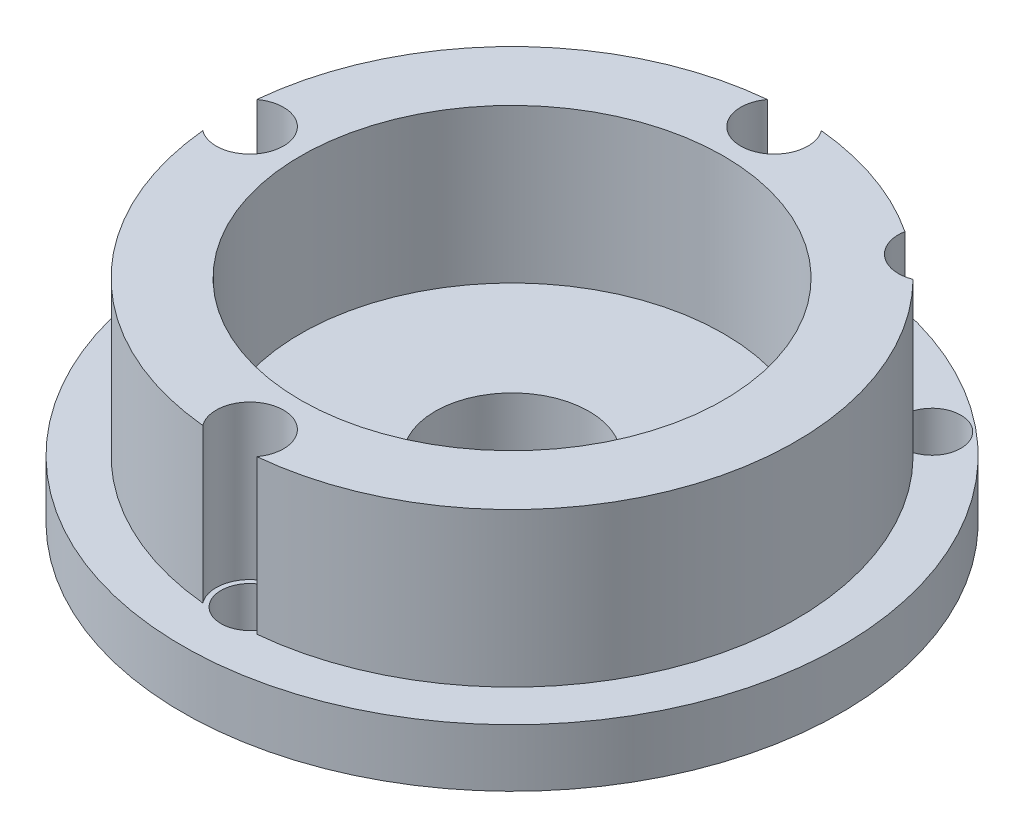
ISO-10303-21;
HEADER;
FILE_DESCRIPTION(('STEP AP214'),'2;1');
FILE_NAME('part.step','',(''),(''),'','','');
FILE_SCHEMA(('AUTOMOTIVE_DESIGN { 1 0 10303 214 1 1 1 1 }'));
ENDSEC;
DATA;
#1=APPLICATION_CONTEXT('core data for automotive mechanical design processes');
#2=APPLICATION_PROTOCOL_DEFINITION('international standard','automotive_design',2000,#1);
#3=PRODUCT_CONTEXT('',#1,'mechanical');
#4=PRODUCT('Part','Part','',(#3));
#5=PRODUCT_RELATED_PRODUCT_CATEGORY('part','',(#4));
#6=PRODUCT_DEFINITION_FORMATION('','',#4);
#7=PRODUCT_DEFINITION_CONTEXT('part definition',#1,'design');
#8=PRODUCT_DEFINITION('design','',#6,#7);
#9=PRODUCT_DEFINITION_SHAPE('','',#8);
#10=(LENGTH_UNIT() NAMED_UNIT(*) SI_UNIT(.MILLI.,.METRE.));
#11=(NAMED_UNIT(*) PLANE_ANGLE_UNIT() SI_UNIT($,.RADIAN.));
#12=(NAMED_UNIT(*) SI_UNIT($,.STERADIAN.) SOLID_ANGLE_UNIT());
#13=UNCERTAINTY_MEASURE_WITH_UNIT(LENGTH_MEASURE(1.E-05),#10,'distance_accuracy_value','');
#14=(GEOMETRIC_REPRESENTATION_CONTEXT(3) GLOBAL_UNCERTAINTY_ASSIGNED_CONTEXT((#13)) GLOBAL_UNIT_ASSIGNED_CONTEXT((#10,
#11,#12)) REPRESENTATION_CONTEXT('',''));
#15=CARTESIAN_POINT('',(0.,0.,0.));
#16=DIRECTION('',(0.,0.,1.));
#17=DIRECTION('',(1.,0.,0.));
#18=AXIS2_PLACEMENT_3D('',#15,#16,#17);
#19=CARTESIAN_POINT('',(-17.1428571428571,3.,0.));
#20=DIRECTION('',(0.,-1.,0.));
#21=DIRECTION('',(0.,0.,-1.));
#22=AXIS2_PLACEMENT_3D('',#19,#20,#21);
#23=PLANE('',#22);
#24=CARTESIAN_POINT('',(0.,3.,0.));
#25=DIRECTION('',(0.,1.,0.));
#26=DIRECTION('',(0.,0.,1.));
#27=AXIS2_PLACEMENT_3D('',#24,#25,#26);
#28=CIRCLE('',#27,4.);
#29=CARTESIAN_POINT('',(0.,3.,4.));
#30=VERTEX_POINT('',#29);
#31=EDGE_CURVE('E159',#30,#30,#28,.F.);
#32=ORIENTED_EDGE('',*,*,#31,.T.);
#33=EDGE_LOOP('',(#32));
#34=FACE_BOUND('',#33,.T.);
#35=CARTESIAN_POINT('',(0.,3.,0.));
#36=DIRECTION('',(0.,-1.,0.));
#37=DIRECTION('',(0.,0.,-1.));
#38=AXIS2_PLACEMENT_3D('',#35,#36,#37);
#39=CIRCLE('',#38,11.);
#40=CARTESIAN_POINT('',(0.,3.,-11.));
#41=VERTEX_POINT('',#40);
#42=EDGE_CURVE('E11',#41,#41,#39,.T.);
#43=ORIENTED_EDGE('',*,*,#42,.F.);
#44=EDGE_LOOP('',(#43));
#45=FACE_BOUND('',#44,.T.);
#46=ADVANCED_FACE('F39',(#34,#45),#23,.F.);
#47=CARTESIAN_POINT('',(-13.64,-7.,0.));
#48=DIRECTION('',(0.,1.,0.));
#49=DIRECTION('',(0.,0.,1.));
#50=AXIS2_PLACEMENT_3D('',#47,#48,#49);
#51=CYLINDRICAL_SURFACE('',#50,1.5);
#52=CARTESIAN_POINT('',(-13.64,0.,0.));
#53=DIRECTION('',(0.,1.,0.));
#54=DIRECTION('',(0.,0.,1.));
#55=AXIS2_PLACEMENT_3D('',#52,#53,#54);
#56=CIRCLE('',#55,1.5);
#57=CARTESIAN_POINT('',(-13.64,0.,1.5));
#58=VERTEX_POINT('',#57);
#59=EDGE_CURVE('E275',#58,#58,#56,.T.);
#60=ORIENTED_EDGE('',*,*,#59,.F.);
#61=EDGE_LOOP('',(#60));
#62=FACE_BOUND('',#61,.T.);
#63=CARTESIAN_POINT('',(-13.64,3.,0.));
#64=DIRECTION('',(0.,1.,0.));
#65=DIRECTION('',(0.,0.,1.));
#66=AXIS2_PLACEMENT_3D('',#63,#64,#65);
#67=CIRCLE('',#66,1.5);
#68=CARTESIAN_POINT('',(-13.64,3.,1.5));
#69=VERTEX_POINT('',#68);
#70=EDGE_CURVE('E245',#69,#69,#67,.T.);
#71=ORIENTED_EDGE('',*,*,#70,.T.);
#72=EDGE_LOOP('',(#71));
#73=FACE_BOUND('',#72,.T.);
#74=ADVANCED_FACE('F222',(#62,#73),#51,.F.);
#75=CARTESIAN_POINT('',(0.,-7.,13.64));
#76=DIRECTION('',(0.,1.,0.));
#77=DIRECTION('',(0.,0.,1.));
#78=AXIS2_PLACEMENT_3D('',#75,#76,#77);
#79=CYLINDRICAL_SURFACE('',#78,1.5);
#80=CARTESIAN_POINT('',(0.,0.,13.64));
#81=DIRECTION('',(0.,1.,0.));
#82=DIRECTION('',(0.,0.,1.));
#83=AXIS2_PLACEMENT_3D('',#80,#81,#82);
#84=CIRCLE('',#83,1.5);
#85=CARTESIAN_POINT('',(0.,0.,15.14));
#86=VERTEX_POINT('',#85);
#87=EDGE_CURVE('E279',#86,#86,#84,.T.);
#88=ORIENTED_EDGE('',*,*,#87,.F.);
#89=EDGE_LOOP('',(#88));
#90=FACE_BOUND('',#89,.T.);
#91=CARTESIAN_POINT('',(0.,3.,13.64));
#92=DIRECTION('',(0.,1.,0.));
#93=DIRECTION('',(0.,0.,1.));
#94=AXIS2_PLACEMENT_3D('',#91,#92,#93);
#95=CIRCLE('',#94,1.5);
#96=CARTESIAN_POINT('',(0.,3.,15.14));
#97=VERTEX_POINT('',#96);
#98=EDGE_CURVE('E256',#97,#97,#95,.T.);
#99=ORIENTED_EDGE('',*,*,#98,.T.);
#100=EDGE_LOOP('',(#99));
#101=FACE_BOUND('',#100,.T.);
#102=ADVANCED_FACE('F227',(#90,#101),#79,.F.);
#103=CARTESIAN_POINT('',(0.,-7.,-13.64));
#104=DIRECTION('',(0.,1.,0.));
#105=DIRECTION('',(0.,0.,1.));
#106=AXIS2_PLACEMENT_3D('',#103,#104,#105);
#107=CYLINDRICAL_SURFACE('',#106,1.5);
#108=CARTESIAN_POINT('',(0.,0.,-13.64));
#109=DIRECTION('',(0.,1.,0.));
#110=DIRECTION('',(0.,0.,1.));
#111=AXIS2_PLACEMENT_3D('',#108,#109,#110);
#112=CIRCLE('',#111,1.5);
#113=CARTESIAN_POINT('',(0.,0.,-12.14));
#114=VERTEX_POINT('',#113);
#115=EDGE_CURVE('E271',#114,#114,#112,.T.);
#116=ORIENTED_EDGE('',*,*,#115,.F.);
#117=EDGE_LOOP('',(#116));
#118=FACE_BOUND('',#117,.T.);
#119=CARTESIAN_POINT('',(0.,3.,-13.64));
#120=DIRECTION('',(0.,1.,0.));
#121=DIRECTION('',(0.,0.,1.));
#122=AXIS2_PLACEMENT_3D('',#119,#120,#121);
#123=CIRCLE('',#122,1.5);
#124=CARTESIAN_POINT('',(0.,3.,-12.14));
#125=VERTEX_POINT('',#124);
#126=EDGE_CURVE('E249',#125,#125,#123,.T.);
#127=ORIENTED_EDGE('',*,*,#126,.T.);
#128=EDGE_LOOP('',(#127));
#129=FACE_BOUND('',#128,.T.);
#130=ADVANCED_FACE('F313',(#118,#129),#107,.F.);
#131=CARTESIAN_POINT('',(9.84473678631215,10.,-11.9979813972281));
#132=DIRECTION('',(0.,-1.,0.));
#133=DIRECTION('',(0.,0.,-1.));
#134=AXIS2_PLACEMENT_3D('',#131,#132,#133);
#135=CYLINDRICAL_SURFACE('',#134,1.5);
#136=CARTESIAN_POINT('',(9.84473678631215,0.,-11.9979813972281));
#137=DIRECTION('',(0.,-1.,0.));
#138=DIRECTION('',(0.,0.,-1.));
#139=AXIS2_PLACEMENT_3D('',#136,#137,#138);
#140=CIRCLE('',#139,1.5);
#141=CARTESIAN_POINT('',(9.84473678631215,0.,-13.4979813972281));
#142=VERTEX_POINT('',#141);
#143=EDGE_CURVE('E135',#142,#142,#140,.T.);
#144=ORIENTED_EDGE('',*,*,#143,.T.);
#145=EDGE_LOOP('',(#144));
#146=FACE_BOUND('',#145,.T.);
#147=CARTESIAN_POINT('',(9.84473678631215,3.,-11.9979813972281));
#148=DIRECTION('',(0.,-1.,0.));
#149=DIRECTION('',(0.,0.,-1.));
#150=AXIS2_PLACEMENT_3D('',#147,#148,#149);
#151=CIRCLE('',#150,1.5);
#152=CARTESIAN_POINT('',(9.84473678631215,3.,-13.4979813972281));
#153=VERTEX_POINT('',#152);
#154=EDGE_CURVE('E141',#153,#153,#151,.T.);
#155=ORIENTED_EDGE('',*,*,#154,.F.);
#156=EDGE_LOOP('',(#155));
#157=FACE_BOUND('',#156,.T.);
#158=ADVANCED_FACE('F308',(#146,#157),#135,.F.);
#159=CARTESIAN_POINT('',(0.,0.,0.));
#160=DIRECTION('',(0.,-1.,0.));
#161=DIRECTION('',(0.,0.,-1.));
#162=AXIS2_PLACEMENT_3D('',#159,#160,#161);
#163=CYLINDRICAL_SURFACE('',#162,4.);
#164=CARTESIAN_POINT('',(0.,0.,0.));
#165=DIRECTION('',(0.,-1.,0.));
#166=DIRECTION('',(0.,0.,-1.));
#167=AXIS2_PLACEMENT_3D('',#164,#165,#166);
#168=CIRCLE('',#167,4.);
#169=CARTESIAN_POINT('',(0.,0.,-4.));
#170=VERTEX_POINT('',#169);
#171=EDGE_CURVE('E262',#170,#170,#168,.T.);
#172=ORIENTED_EDGE('',*,*,#171,.T.);
#173=EDGE_LOOP('',(#172));
#174=FACE_BOUND('',#173,.T.);
#175=ORIENTED_EDGE('',*,*,#31,.F.);
#176=EDGE_LOOP('',(#175));
#177=FACE_BOUND('',#176,.T.);
#178=ADVANCED_FACE('F41',(#174,#177),#163,.F.);
#179=CARTESIAN_POINT('',(0.,11.,0.));
#180=DIRECTION('',(0.,-1.,0.));
#181=DIRECTION('',(0.,0.,-1.));
#182=AXIS2_PLACEMENT_3D('',#179,#180,#181);
#183=CYLINDRICAL_SURFACE('',#182,14.75);
#184=CARTESIAN_POINT('',(0.,11.,0.));
#185=DIRECTION('',(0.,1.,0.));
#186=DIRECTION('',(0.,0.,1.));
#187=AXIS2_PLACEMENT_3D('',#184,#185,#186);
#188=CIRCLE('',#187,14.75);
#189=CARTESIAN_POINT('',(-1.40529458178791,11.,-14.6829032258065));
#190=VERTEX_POINT('',#189);
#191=CARTESIAN_POINT('',(-14.6829032258065,11.,-1.40529458178792));
#192=VERTEX_POINT('',#191);
#193=EDGE_CURVE('E144',#190,#192,#188,.T.);
#194=ORIENTED_EDGE('',*,*,#193,.F.);
#195=DIRECTION('',(0.,1.,0.));
#196=VECTOR('',#195,1.);
#197=CARTESIAN_POINT('',(-1.40529458178792,7.,-14.6829032258065));
#198=LINE('',#197,#196);
#199=CARTESIAN_POINT('',(-1.40529458178792,3.,-14.6829032258065));
#200=VERTEX_POINT('',#199);
#201=EDGE_CURVE('E55',#190,#200,#198,.F.);
#202=ORIENTED_EDGE('',*,*,#201,.T.);
#203=CARTESIAN_POINT('',(0.,3.,0.));
#204=DIRECTION('',(0.,1.,0.));
#205=DIRECTION('',(0.,0.,1.));
#206=AXIS2_PLACEMENT_3D('',#203,#204,#205);
#207=CIRCLE('',#206,14.75);
#208=CARTESIAN_POINT('',(-14.6829032258065,3.,-1.40529458178792));
#209=VERTEX_POINT('',#208);
#210=EDGE_CURVE('E155',#200,#209,#207,.T.);
#211=ORIENTED_EDGE('',*,*,#210,.T.);
#212=DIRECTION('',(0.,1.,0.));
#213=VECTOR('',#212,1.);
#214=CARTESIAN_POINT('',(-14.6829032258065,7.,-1.40529458178792));
#215=LINE('',#214,#213);
#216=EDGE_CURVE('E116',#209,#192,#215,.T.);
#217=ORIENTED_EDGE('',*,*,#216,.T.);
#218=EDGE_LOOP('',(#194,#202,#211,#217));
#219=FACE_BOUND('',#218,.T.);
#220=ADVANCED_FACE('F215',(#219),#183,.T.);
#221=CARTESIAN_POINT('',(8.12308631720752,11.,-12.3117004789426));
#222=VERTEX_POINT('',#221);
#223=CARTESIAN_POINT('',(1.40529458178792,11.,-14.6829032258065));
#224=VERTEX_POINT('',#223);
#225=EDGE_CURVE('E136',#222,#224,#188,.T.);
#226=ORIENTED_EDGE('',*,*,#225,.F.);
#227=DIRECTION('',(0.,1.,0.));
#228=VECTOR('',#227,1.);
#229=CARTESIAN_POINT('',(8.12308631720752,7.,-12.3117004789426));
#230=LINE('',#229,#228);
#231=CARTESIAN_POINT('',(8.12308631720752,3.,-12.3117004789426));
#232=VERTEX_POINT('',#231);
#233=EDGE_CURVE('E63',#222,#232,#230,.F.);
#234=ORIENTED_EDGE('',*,*,#233,.T.);
#235=CARTESIAN_POINT('',(1.40529458178792,3.,-14.6829032258065));
#236=VERTEX_POINT('',#235);
#237=EDGE_CURVE('E151',#232,#236,#207,.T.);
#238=ORIENTED_EDGE('',*,*,#237,.T.);
#239=DIRECTION('',(0.,1.,0.));
#240=VECTOR('',#239,1.);
#241=CARTESIAN_POINT('',(1.40529458178792,7.,-14.6829032258065));
#242=LINE('',#241,#240);
#243=EDGE_CURVE('E176',#236,#224,#242,.T.);
#244=ORIENTED_EDGE('',*,*,#243,.T.);
#245=EDGE_LOOP('',(#226,#234,#238,#244));
#246=FACE_BOUND('',#245,.T.);
#247=ADVANCED_FACE('F239',(#246),#183,.T.);
#248=CARTESIAN_POINT('',(1.40529458178792,3.,14.6829032258065));
#249=VERTEX_POINT('',#248);
#250=CARTESIAN_POINT('',(10.4885892073803,3.,-10.3707278644667));
#251=VERTEX_POINT('',#250);
#252=EDGE_CURVE('E147',#249,#251,#207,.T.);
#253=ORIENTED_EDGE('',*,*,#252,.T.);
#254=DIRECTION('',(0.,1.,0.));
#255=VECTOR('',#254,1.);
#256=CARTESIAN_POINT('',(10.4885892073803,7.,-10.3707278644667));
#257=LINE('',#256,#255);
#258=CARTESIAN_POINT('',(10.4885892073803,11.,-10.3707278644667));
#259=VERTEX_POINT('',#258);
#260=EDGE_CURVE('E133',#251,#259,#257,.T.);
#261=ORIENTED_EDGE('',*,*,#260,.T.);
#262=CARTESIAN_POINT('',(1.40529458178792,11.,14.6829032258065));
#263=VERTEX_POINT('',#262);
#264=EDGE_CURVE('E124',#263,#259,#188,.T.);
#265=ORIENTED_EDGE('',*,*,#264,.F.);
#266=DIRECTION('',(0.,1.,0.));
#267=VECTOR('',#266,1.);
#268=CARTESIAN_POINT('',(1.40529458178792,7.,14.6829032258065));
#269=LINE('',#268,#267);
#270=EDGE_CURVE('E104',#263,#249,#269,.F.);
#271=ORIENTED_EDGE('',*,*,#270,.T.);
#272=EDGE_LOOP('',(#253,#261,#265,#271));
#273=FACE_BOUND('',#272,.T.);
#274=ADVANCED_FACE('F132',(#273),#183,.T.);
#275=ORIENTED_EDGE('',*,*,#210,.F.);
#276=CARTESIAN_POINT('',(0.,3.,-13.64));
#277=DIRECTION('',(0.,1.,0.));
#278=DIRECTION('',(0.,0.,1.));
#279=AXIS2_PLACEMENT_3D('',#276,#277,#278);
#280=CIRCLE('',#279,1.75);
#281=EDGE_CURVE('E192',#200,#236,#280,.T.);
#282=ORIENTED_EDGE('',*,*,#281,.T.);
#283=ORIENTED_EDGE('',*,*,#237,.F.);
#284=CARTESIAN_POINT('',(9.84473678631215,3.,-11.9979813972281));
#285=DIRECTION('',(0.,1.,0.));
#286=DIRECTION('',(0.,0.,1.));
#287=AXIS2_PLACEMENT_3D('',#284,#285,#286);
#288=CIRCLE('',#287,1.75);
#289=EDGE_CURVE('E117',#232,#251,#288,.T.);
#290=ORIENTED_EDGE('',*,*,#289,.T.);
#291=ORIENTED_EDGE('',*,*,#252,.F.);
#292=CARTESIAN_POINT('',(0.,3.,13.64));
#293=DIRECTION('',(0.,1.,0.));
#294=DIRECTION('',(0.,0.,1.));
#295=AXIS2_PLACEMENT_3D('',#292,#293,#294);
#296=CIRCLE('',#295,1.75);
#297=CARTESIAN_POINT('',(-1.40529458178792,3.,14.6829032258065));
#298=VERTEX_POINT('',#297);
#299=EDGE_CURVE('E110',#249,#298,#296,.T.);
#300=ORIENTED_EDGE('',*,*,#299,.T.);
#301=CARTESIAN_POINT('',(-14.6829032258065,3.,1.40529458178792));
#302=VERTEX_POINT('',#301);
#303=EDGE_CURVE('E152',#302,#298,#207,.T.);
#304=ORIENTED_EDGE('',*,*,#303,.F.);
#305=CARTESIAN_POINT('',(-13.64,3.,0.));
#306=DIRECTION('',(0.,1.,0.));
#307=DIRECTION('',(0.,0.,1.));
#308=AXIS2_PLACEMENT_3D('',#305,#306,#307);
#309=CIRCLE('',#308,1.75);
#310=EDGE_CURVE('E188',#302,#209,#309,.T.);
#311=ORIENTED_EDGE('',*,*,#310,.T.);
#312=EDGE_LOOP('',(#275,#282,#283,#290,#291,#300,#304,#311));
#313=FACE_BOUND('',#312,.T.);
#314=ORIENTED_EDGE('',*,*,#70,.F.);
#315=EDGE_LOOP('',(#314));
#316=FACE_BOUND('',#315,.T.);
#317=ORIENTED_EDGE('',*,*,#126,.F.);
#318=EDGE_LOOP('',(#317));
#319=FACE_BOUND('',#318,.T.);
#320=ORIENTED_EDGE('',*,*,#154,.T.);
#321=EDGE_LOOP('',(#320));
#322=FACE_BOUND('',#321,.T.);
#323=ORIENTED_EDGE('',*,*,#98,.F.);
#324=EDGE_LOOP('',(#323));
#325=FACE_BOUND('',#324,.T.);
#326=CARTESIAN_POINT('',(0.,3.,0.));
#327=DIRECTION('',(0.,-1.,0.));
#328=DIRECTION('',(0.,0.,-1.));
#329=AXIS2_PLACEMENT_3D('',#326,#327,#328);
#330=CIRCLE('',#329,17.1428571428571);
#331=CARTESIAN_POINT('',(0.,3.,-17.1428571428571));
#332=VERTEX_POINT('',#331);
#333=EDGE_CURVE('E259',#332,#332,#330,.T.);
#334=ORIENTED_EDGE('',*,*,#333,.F.);
#335=EDGE_LOOP('',(#334));
#336=FACE_BOUND('',#335,.T.);
#337=ADVANCED_FACE('F223',(#313,#316,#319,#322,#325,#336),#23,.F.);
#338=CARTESIAN_POINT('',(0.,0.,0.));
#339=DIRECTION('',(0.,-1.,0.));
#340=DIRECTION('',(0.,0.,-1.));
#341=AXIS2_PLACEMENT_3D('',#338,#339,#340);
#342=CYLINDRICAL_SURFACE('',#341,17.1428571428571);
#343=CARTESIAN_POINT('',(0.,0.,0.));
#344=DIRECTION('',(0.,-1.,0.));
#345=DIRECTION('',(0.,0.,-1.));
#346=AXIS2_PLACEMENT_3D('',#343,#344,#345);
#347=CIRCLE('',#346,17.1428571428571);
#348=CARTESIAN_POINT('',(0.,0.,-17.1428571428571));
#349=VERTEX_POINT('',#348);
#350=EDGE_CURVE('E263',#349,#349,#347,.T.);
#351=ORIENTED_EDGE('',*,*,#350,.F.);
#352=EDGE_LOOP('',(#351));
#353=FACE_BOUND('',#352,.T.);
#354=ORIENTED_EDGE('',*,*,#333,.T.);
#355=EDGE_LOOP('',(#354));
#356=FACE_BOUND('',#355,.T.);
#357=ADVANCED_FACE('F217',(#353,#356),#342,.T.);
#358=CARTESIAN_POINT('',(-14.,0.,0.));
#359=DIRECTION('',(0.,1.,0.));
#360=DIRECTION('',(0.,0.,1.));
#361=AXIS2_PLACEMENT_3D('',#358,#359,#360);
#362=PLANE('',#361);
#363=ORIENTED_EDGE('',*,*,#143,.F.);
#364=EDGE_LOOP('',(#363));
#365=FACE_BOUND('',#364,.T.);
#366=ORIENTED_EDGE('',*,*,#115,.T.);
#367=EDGE_LOOP('',(#366));
#368=FACE_BOUND('',#367,.T.);
#369=ORIENTED_EDGE('',*,*,#87,.T.);
#370=EDGE_LOOP('',(#369));
#371=FACE_BOUND('',#370,.T.);
#372=ORIENTED_EDGE('',*,*,#59,.T.);
#373=EDGE_LOOP('',(#372));
#374=FACE_BOUND('',#373,.T.);
#375=ORIENTED_EDGE('',*,*,#171,.F.);
#376=EDGE_LOOP('',(#375));
#377=FACE_BOUND('',#376,.T.);
#378=ORIENTED_EDGE('',*,*,#350,.T.);
#379=EDGE_LOOP('',(#378));
#380=FACE_BOUND('',#379,.T.);
#381=ADVANCED_FACE('F207',(#365,#368,#371,#374,#377,#380),#362,.F.);
#382=CARTESIAN_POINT('',(0.,11.,0.));
#383=DIRECTION('',(0.,1.,0.));
#384=DIRECTION('',(0.,0.,1.));
#385=AXIS2_PLACEMENT_3D('',#382,#383,#384);
#386=PLANE('',#385);
#387=CARTESIAN_POINT('',(9.84473678631215,11.,-11.9979813972281));
#388=DIRECTION('',(0.,1.,0.));
#389=DIRECTION('',(0.,0.,1.));
#390=AXIS2_PLACEMENT_3D('',#387,#388,#389);
#391=CIRCLE('',#390,1.75);
#392=EDGE_CURVE('E48',#222,#259,#391,.T.);
#393=ORIENTED_EDGE('',*,*,#392,.F.);
#394=ORIENTED_EDGE('',*,*,#225,.T.);
#395=CARTESIAN_POINT('',(0.,11.,-13.64));
#396=DIRECTION('',(0.,1.,0.));
#397=DIRECTION('',(0.,0.,1.));
#398=AXIS2_PLACEMENT_3D('',#395,#396,#397);
#399=CIRCLE('',#398,1.75);
#400=EDGE_CURVE('E291',#190,#224,#399,.T.);
#401=ORIENTED_EDGE('',*,*,#400,.F.);
#402=ORIENTED_EDGE('',*,*,#193,.T.);
#403=CARTESIAN_POINT('',(-13.64,11.,0.));
#404=DIRECTION('',(0.,1.,0.));
#405=DIRECTION('',(0.,0.,1.));
#406=AXIS2_PLACEMENT_3D('',#403,#404,#405);
#407=CIRCLE('',#406,1.75);
#408=CARTESIAN_POINT('',(-14.6829032258065,11.,1.40529458178792));
#409=VERTEX_POINT('',#408);
#410=EDGE_CURVE('E185',#409,#192,#407,.T.);
#411=ORIENTED_EDGE('',*,*,#410,.F.);
#412=CARTESIAN_POINT('',(-1.40529458178792,11.,14.6829032258065));
#413=VERTEX_POINT('',#412);
#414=EDGE_CURVE('E127',#409,#413,#188,.T.);
#415=ORIENTED_EDGE('',*,*,#414,.T.);
#416=CARTESIAN_POINT('',(0.,11.,13.64));
#417=DIRECTION('',(0.,1.,0.));
#418=DIRECTION('',(0.,0.,1.));
#419=AXIS2_PLACEMENT_3D('',#416,#417,#418);
#420=CIRCLE('',#419,1.75);
#421=EDGE_CURVE('E108',#263,#413,#420,.T.);
#422=ORIENTED_EDGE('',*,*,#421,.F.);
#423=ORIENTED_EDGE('',*,*,#264,.T.);
#424=EDGE_LOOP('',(#393,#394,#401,#402,#411,#415,#422,#423));
#425=FACE_BOUND('',#424,.T.);
#426=CARTESIAN_POINT('',(0.,11.,0.));
#427=DIRECTION('',(0.,1.,0.));
#428=DIRECTION('',(0.,0.,1.));
#429=AXIS2_PLACEMENT_3D('',#426,#427,#428);
#430=CIRCLE('',#429,11.);
#431=CARTESIAN_POINT('',(0.,11.,11.));
#432=VERTEX_POINT('',#431);
#433=EDGE_CURVE('E129',#432,#432,#430,.T.);
#434=ORIENTED_EDGE('',*,*,#433,.F.);
#435=EDGE_LOOP('',(#434));
#436=FACE_BOUND('',#435,.T.);
#437=ADVANCED_FACE('F122',(#425,#436),#386,.T.);
#438=ORIENTED_EDGE('',*,*,#414,.F.);
#439=DIRECTION('',(0.,1.,0.));
#440=VECTOR('',#439,1.);
#441=CARTESIAN_POINT('',(-14.6829032258065,7.,1.40529458178792));
#442=LINE('',#441,#440);
#443=EDGE_CURVE('E288',#409,#302,#442,.F.);
#444=ORIENTED_EDGE('',*,*,#443,.T.);
#445=ORIENTED_EDGE('',*,*,#303,.T.);
#446=DIRECTION('',(0.,1.,0.));
#447=VECTOR('',#446,1.);
#448=CARTESIAN_POINT('',(-1.40529458178792,7.,14.6829032258065));
#449=LINE('',#448,#447);
#450=EDGE_CURVE('E268',#298,#413,#449,.T.);
#451=ORIENTED_EDGE('',*,*,#450,.T.);
#452=EDGE_LOOP('',(#438,#444,#445,#451));
#453=FACE_BOUND('',#452,.T.);
#454=ADVANCED_FACE('F206',(#453),#183,.T.);
#455=CARTESIAN_POINT('',(0.,3.,13.64));
#456=DIRECTION('',(0.,1.,0.));
#457=DIRECTION('',(0.,0.,1.));
#458=AXIS2_PLACEMENT_3D('',#455,#456,#457);
#459=CYLINDRICAL_SURFACE('',#458,1.75);
#460=ORIENTED_EDGE('',*,*,#421,.T.);
#461=ORIENTED_EDGE('',*,*,#450,.F.);
#462=ORIENTED_EDGE('',*,*,#299,.F.);
#463=ORIENTED_EDGE('',*,*,#270,.F.);
#464=EDGE_LOOP('',(#460,#461,#462,#463));
#465=FACE_BOUND('',#464,.T.);
#466=ADVANCED_FACE('F106',(#465),#459,.F.);
#467=CARTESIAN_POINT('',(-13.64,3.,0.));
#468=DIRECTION('',(0.,1.,0.));
#469=DIRECTION('',(0.,0.,1.));
#470=AXIS2_PLACEMENT_3D('',#467,#468,#469);
#471=CYLINDRICAL_SURFACE('',#470,1.75);
#472=ORIENTED_EDGE('',*,*,#310,.F.);
#473=ORIENTED_EDGE('',*,*,#443,.F.);
#474=ORIENTED_EDGE('',*,*,#410,.T.);
#475=ORIENTED_EDGE('',*,*,#216,.F.);
#476=EDGE_LOOP('',(#472,#473,#474,#475));
#477=FACE_BOUND('',#476,.T.);
#478=ADVANCED_FACE('F300',(#477),#471,.F.);
#479=CARTESIAN_POINT('',(0.,3.,-13.64));
#480=DIRECTION('',(0.,1.,0.));
#481=DIRECTION('',(0.,0.,1.));
#482=AXIS2_PLACEMENT_3D('',#479,#480,#481);
#483=CYLINDRICAL_SURFACE('',#482,1.75);
#484=ORIENTED_EDGE('',*,*,#400,.T.);
#485=ORIENTED_EDGE('',*,*,#243,.F.);
#486=ORIENTED_EDGE('',*,*,#281,.F.);
#487=ORIENTED_EDGE('',*,*,#201,.F.);
#488=EDGE_LOOP('',(#484,#485,#486,#487));
#489=FACE_BOUND('',#488,.T.);
#490=ADVANCED_FACE('F298',(#489),#483,.F.);
#491=CARTESIAN_POINT('',(9.84473678631215,3.,-11.9979813972281));
#492=DIRECTION('',(0.,1.,0.));
#493=DIRECTION('',(0.,0.,1.));
#494=AXIS2_PLACEMENT_3D('',#491,#492,#493);
#495=CYLINDRICAL_SURFACE('',#494,1.75);
#496=ORIENTED_EDGE('',*,*,#392,.T.);
#497=ORIENTED_EDGE('',*,*,#260,.F.);
#498=ORIENTED_EDGE('',*,*,#289,.F.);
#499=ORIENTED_EDGE('',*,*,#233,.F.);
#500=EDGE_LOOP('',(#496,#497,#498,#499));
#501=FACE_BOUND('',#500,.T.);
#502=ADVANCED_FACE('F294',(#501),#495,.F.);
#503=CARTESIAN_POINT('',(0.,0.999999999999996,0.));
#504=DIRECTION('',(0.,1.,0.));
#505=DIRECTION('',(0.,0.,1.));
#506=AXIS2_PLACEMENT_3D('',#503,#504,#505);
#507=CYLINDRICAL_SURFACE('',#506,11.);
#508=ORIENTED_EDGE('',*,*,#433,.T.);
#509=EDGE_LOOP('',(#508));
#510=FACE_BOUND('',#509,.T.);
#511=ORIENTED_EDGE('',*,*,#42,.T.);
#512=EDGE_LOOP('',(#511));
#513=FACE_BOUND('',#512,.T.);
#514=ADVANCED_FACE('F203',(#510,#513),#507,.F.);
#515=CLOSED_SHELL('',(#46,#74,#102,#130,#158,#178,#220,#247,#274,#337,#357,#381,#437,#454,#466,
#478,#490,#502,#514));
#516=MANIFOLD_SOLID_BREP('B2',#515);
#517=ADVANCED_BREP_SHAPE_REPRESENTATION('',(#18,#516),#14);
#518=SHAPE_DEFINITION_REPRESENTATION(#9,#517);
ENDSEC;
END-ISO-10303-21;
